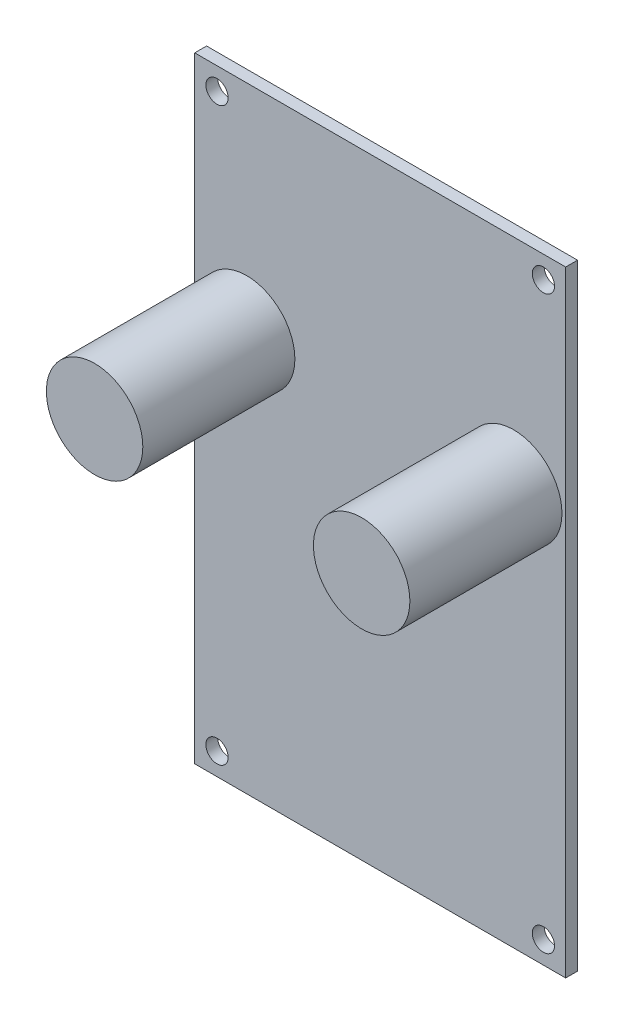
ISO-10303-21;
HEADER;
FILE_DESCRIPTION(('STEP AP214'),'2;1');
FILE_NAME('part.step','',(''),(''),'','','');
FILE_SCHEMA(('AUTOMOTIVE_DESIGN { 1 0 10303 214 1 1 1 1 }'));
ENDSEC;
DATA;
#1=APPLICATION_CONTEXT('core data for automotive mechanical design processes');
#2=APPLICATION_PROTOCOL_DEFINITION('international standard','automotive_design',2000,#1);
#3=PRODUCT_CONTEXT('',#1,'mechanical');
#4=PRODUCT('Part','Part','',(#3));
#5=PRODUCT_RELATED_PRODUCT_CATEGORY('part','',(#4));
#6=PRODUCT_DEFINITION_FORMATION('','',#4);
#7=PRODUCT_DEFINITION_CONTEXT('part definition',#1,'design');
#8=PRODUCT_DEFINITION('design','',#6,#7);
#9=PRODUCT_DEFINITION_SHAPE('','',#8);
#10=(LENGTH_UNIT() NAMED_UNIT(*) SI_UNIT(.MILLI.,.METRE.));
#11=(NAMED_UNIT(*) PLANE_ANGLE_UNIT() SI_UNIT($,.RADIAN.));
#12=(NAMED_UNIT(*) SI_UNIT($,.STERADIAN.) SOLID_ANGLE_UNIT());
#13=UNCERTAINTY_MEASURE_WITH_UNIT(LENGTH_MEASURE(1.E-05),#10,'distance_accuracy_value','');
#14=(GEOMETRIC_REPRESENTATION_CONTEXT(3) GLOBAL_UNCERTAINTY_ASSIGNED_CONTEXT((#13)) GLOBAL_UNIT_ASSIGNED_CONTEXT((#10,
#11,#12)) REPRESENTATION_CONTEXT('',''));
#15=CARTESIAN_POINT('',(0.,0.,0.));
#16=DIRECTION('',(0.,0.,1.));
#17=DIRECTION('',(1.,0.,0.));
#18=AXIS2_PLACEMENT_3D('',#15,#16,#17);
#19=CARTESIAN_POINT('',(0.,0.,1.6));
#20=DIRECTION('',(0.,0.,1.));
#21=DIRECTION('',(1.,0.,0.));
#22=AXIS2_PLACEMENT_3D('',#19,#20,#21);
#23=PLANE('',#22);
#24=CARTESIAN_POINT('',(43.,-29.,1.6));
#25=DIRECTION('',(0.,0.,1.));
#26=DIRECTION('',(1.,0.,0.));
#27=AXIS2_PLACEMENT_3D('',#24,#25,#26);
#28=CIRCLE('',#27,6.5);
#29=CARTESIAN_POINT('',(49.5,-29.,1.6));
#30=VERTEX_POINT('',#29);
#31=EDGE_CURVE('E142',#30,#30,#28,.T.);
#32=ORIENTED_EDGE('',*,*,#31,.F.);
#33=EDGE_LOOP('',(#32));
#34=FACE_BOUND('',#33,.T.);
#35=CARTESIAN_POINT('',(7.,-29.,1.6));
#36=DIRECTION('',(0.,0.,1.));
#37=DIRECTION('',(1.,0.,0.));
#38=AXIS2_PLACEMENT_3D('',#35,#36,#37);
#39=CIRCLE('',#38,6.5);
#40=CARTESIAN_POINT('',(13.5,-29.,1.6));
#41=VERTEX_POINT('',#40);
#42=EDGE_CURVE('E136',#41,#41,#39,.T.);
#43=ORIENTED_EDGE('',*,*,#42,.F.);
#44=EDGE_LOOP('',(#43));
#45=FACE_BOUND('',#44,.T.);
#46=CARTESIAN_POINT('',(47.,-80.,1.6));
#47=DIRECTION('',(0.,0.,1.));
#48=DIRECTION('',(1.,0.,0.));
#49=AXIS2_PLACEMENT_3D('',#46,#47,#48);
#50=CIRCLE('',#49,1.5);
#51=CARTESIAN_POINT('',(48.5,-80.,1.6));
#52=VERTEX_POINT('',#51);
#53=EDGE_CURVE('E121',#52,#52,#50,.T.);
#54=ORIENTED_EDGE('',*,*,#53,.F.);
#55=EDGE_LOOP('',(#54));
#56=FACE_BOUND('',#55,.T.);
#57=CARTESIAN_POINT('',(3.,-3.,1.6));
#58=DIRECTION('',(0.,0.,1.));
#59=DIRECTION('',(1.,0.,0.));
#60=AXIS2_PLACEMENT_3D('',#57,#58,#59);
#61=CIRCLE('',#60,1.5);
#62=CARTESIAN_POINT('',(4.5,-3.,1.6));
#63=VERTEX_POINT('',#62);
#64=EDGE_CURVE('E100',#63,#63,#61,.T.);
#65=ORIENTED_EDGE('',*,*,#64,.F.);
#66=EDGE_LOOP('',(#65));
#67=FACE_BOUND('',#66,.T.);
#68=DIRECTION('',(0.,-1.,0.));
#69=VECTOR('',#68,1.);
#70=CARTESIAN_POINT('',(0.,0.,1.6));
#71=LINE('',#70,#69);
#72=CARTESIAN_POINT('',(0.,0.,1.6));
#73=VERTEX_POINT('',#72);
#74=CARTESIAN_POINT('',(0.,-83.,1.6));
#75=VERTEX_POINT('',#74);
#76=EDGE_CURVE('E85',#73,#75,#71,.T.);
#77=ORIENTED_EDGE('',*,*,#76,.T.);
#78=DIRECTION('',(1.,0.,0.));
#79=VECTOR('',#78,1.);
#80=CARTESIAN_POINT('',(0.,-83.,1.6));
#81=LINE('',#80,#79);
#82=CARTESIAN_POINT('',(50.,-83.,1.6));
#83=VERTEX_POINT('',#82);
#84=EDGE_CURVE('E80',#75,#83,#81,.T.);
#85=ORIENTED_EDGE('',*,*,#84,.T.);
#86=DIRECTION('',(0.,1.,0.));
#87=VECTOR('',#86,1.);
#88=CARTESIAN_POINT('',(50.,0.,1.6));
#89=LINE('',#88,#87);
#90=CARTESIAN_POINT('',(50.,0.,1.6));
#91=VERTEX_POINT('',#90);
#92=EDGE_CURVE('E83',#83,#91,#89,.T.);
#93=ORIENTED_EDGE('',*,*,#92,.T.);
#94=DIRECTION('',(-1.,0.,0.));
#95=VECTOR('',#94,1.);
#96=CARTESIAN_POINT('',(0.,0.,1.6));
#97=LINE('',#96,#95);
#98=EDGE_CURVE('E50',#91,#73,#97,.T.);
#99=ORIENTED_EDGE('',*,*,#98,.T.);
#100=EDGE_LOOP('',(#77,#85,#93,#99));
#101=FACE_BOUND('',#100,.T.);
#102=CARTESIAN_POINT('',(47.,-3.,1.6));
#103=DIRECTION('',(0.,0.,1.));
#104=DIRECTION('',(1.,0.,0.));
#105=AXIS2_PLACEMENT_3D('',#102,#103,#104);
#106=CIRCLE('',#105,1.5);
#107=CARTESIAN_POINT('',(48.5,-3.,1.6));
#108=VERTEX_POINT('',#107);
#109=EDGE_CURVE('E115',#108,#108,#106,.T.);
#110=ORIENTED_EDGE('',*,*,#109,.F.);
#111=EDGE_LOOP('',(#110));
#112=FACE_BOUND('',#111,.T.);
#113=CARTESIAN_POINT('',(3.00000000000001,-80.,1.6));
#114=DIRECTION('',(0.,0.,1.));
#115=DIRECTION('',(1.,0.,0.));
#116=AXIS2_PLACEMENT_3D('',#113,#114,#115);
#117=CIRCLE('',#116,1.5);
#118=CARTESIAN_POINT('',(4.50000000000001,-80.,1.6));
#119=VERTEX_POINT('',#118);
#120=EDGE_CURVE('E127',#119,#119,#117,.T.);
#121=ORIENTED_EDGE('',*,*,#120,.F.);
#122=EDGE_LOOP('',(#121));
#123=FACE_BOUND('',#122,.T.);
#124=ADVANCED_FACE('F33',(#34,#45,#56,#67,#101,#112,#123),#23,.T.);
#125=CARTESIAN_POINT('',(0.,0.,0.));
#126=DIRECTION('',(0.,0.,1.));
#127=DIRECTION('',(1.,0.,0.));
#128=AXIS2_PLACEMENT_3D('',#125,#126,#127);
#129=PLANE('',#128);
#130=DIRECTION('',(0.,-1.,0.));
#131=VECTOR('',#130,1.);
#132=CARTESIAN_POINT('',(0.,0.,0.));
#133=LINE('',#132,#131);
#134=CARTESIAN_POINT('',(0.,0.,0.));
#135=VERTEX_POINT('',#134);
#136=CARTESIAN_POINT('',(0.,-83.,0.));
#137=VERTEX_POINT('',#136);
#138=EDGE_CURVE('E97',#135,#137,#133,.T.);
#139=ORIENTED_EDGE('',*,*,#138,.F.);
#140=DIRECTION('',(-1.,0.,0.));
#141=VECTOR('',#140,1.);
#142=CARTESIAN_POINT('',(0.,0.,0.));
#143=LINE('',#142,#141);
#144=CARTESIAN_POINT('',(50.,0.,0.));
#145=VERTEX_POINT('',#144);
#146=EDGE_CURVE('E73',#145,#135,#143,.T.);
#147=ORIENTED_EDGE('',*,*,#146,.F.);
#148=DIRECTION('',(0.,1.,0.));
#149=VECTOR('',#148,1.);
#150=CARTESIAN_POINT('',(50.,0.,0.));
#151=LINE('',#150,#149);
#152=CARTESIAN_POINT('',(50.,-83.,0.));
#153=VERTEX_POINT('',#152);
#154=EDGE_CURVE('E67',#153,#145,#151,.T.);
#155=ORIENTED_EDGE('',*,*,#154,.F.);
#156=DIRECTION('',(1.,0.,0.));
#157=VECTOR('',#156,1.);
#158=CARTESIAN_POINT('',(0.,-83.,0.));
#159=LINE('',#158,#157);
#160=EDGE_CURVE('E89',#137,#153,#159,.T.);
#161=ORIENTED_EDGE('',*,*,#160,.F.);
#162=EDGE_LOOP('',(#139,#147,#155,#161));
#163=FACE_BOUND('',#162,.T.);
#164=CARTESIAN_POINT('',(3.,-3.,0.));
#165=DIRECTION('',(0.,0.,1.));
#166=DIRECTION('',(1.,0.,0.));
#167=AXIS2_PLACEMENT_3D('',#164,#165,#166);
#168=CIRCLE('',#167,1.5);
#169=CARTESIAN_POINT('',(4.5,-3.,0.));
#170=VERTEX_POINT('',#169);
#171=EDGE_CURVE('E112',#170,#170,#168,.T.);
#172=ORIENTED_EDGE('',*,*,#171,.T.);
#173=EDGE_LOOP('',(#172));
#174=FACE_BOUND('',#173,.T.);
#175=CARTESIAN_POINT('',(47.,-3.,0.));
#176=DIRECTION('',(0.,0.,1.));
#177=DIRECTION('',(1.,0.,0.));
#178=AXIS2_PLACEMENT_3D('',#175,#176,#177);
#179=CIRCLE('',#178,1.5);
#180=CARTESIAN_POINT('',(48.5,-3.,0.));
#181=VERTEX_POINT('',#180);
#182=EDGE_CURVE('E118',#181,#181,#179,.T.);
#183=ORIENTED_EDGE('',*,*,#182,.T.);
#184=EDGE_LOOP('',(#183));
#185=FACE_BOUND('',#184,.T.);
#186=CARTESIAN_POINT('',(47.,-80.,0.));
#187=DIRECTION('',(0.,0.,1.));
#188=DIRECTION('',(1.,0.,0.));
#189=AXIS2_PLACEMENT_3D('',#186,#187,#188);
#190=CIRCLE('',#189,1.5);
#191=CARTESIAN_POINT('',(48.5,-80.,0.));
#192=VERTEX_POINT('',#191);
#193=EDGE_CURVE('E124',#192,#192,#190,.T.);
#194=ORIENTED_EDGE('',*,*,#193,.T.);
#195=EDGE_LOOP('',(#194));
#196=FACE_BOUND('',#195,.T.);
#197=CARTESIAN_POINT('',(3.00000000000001,-80.,0.));
#198=DIRECTION('',(0.,0.,1.));
#199=DIRECTION('',(1.,0.,0.));
#200=AXIS2_PLACEMENT_3D('',#197,#198,#199);
#201=CIRCLE('',#200,1.5);
#202=CARTESIAN_POINT('',(4.50000000000001,-80.,0.));
#203=VERTEX_POINT('',#202);
#204=EDGE_CURVE('E130',#203,#203,#201,.T.);
#205=ORIENTED_EDGE('',*,*,#204,.T.);
#206=EDGE_LOOP('',(#205));
#207=FACE_BOUND('',#206,.T.);
#208=ADVANCED_FACE('F108',(#163,#174,#185,#196,#207),#129,.F.);
#209=CARTESIAN_POINT('',(0.,0.,1.6));
#210=DIRECTION('',(1.,0.,0.));
#211=DIRECTION('',(0.,1.,0.));
#212=AXIS2_PLACEMENT_3D('',#209,#210,#211);
#213=PLANE('',#212);
#214=ORIENTED_EDGE('',*,*,#138,.T.);
#215=DIRECTION('',(0.,0.,-1.));
#216=VECTOR('',#215,1.);
#217=CARTESIAN_POINT('',(0.,-83.,1.6));
#218=LINE('',#217,#216);
#219=EDGE_CURVE('E11',#75,#137,#218,.T.);
#220=ORIENTED_EDGE('',*,*,#219,.F.);
#221=ORIENTED_EDGE('',*,*,#76,.F.);
#222=DIRECTION('',(0.,0.,-1.));
#223=VECTOR('',#222,1.);
#224=CARTESIAN_POINT('',(0.,0.,1.6));
#225=LINE('',#224,#223);
#226=EDGE_CURVE('E93',#73,#135,#225,.T.);
#227=ORIENTED_EDGE('',*,*,#226,.T.);
#228=EDGE_LOOP('',(#214,#220,#221,#227));
#229=FACE_BOUND('',#228,.T.);
#230=ADVANCED_FACE('F35',(#229),#213,.F.);
#231=CARTESIAN_POINT('',(0.,-83.,1.6));
#232=DIRECTION('',(0.,1.,0.));
#233=DIRECTION('',(0.,0.,1.));
#234=AXIS2_PLACEMENT_3D('',#231,#232,#233);
#235=PLANE('',#234);
#236=ORIENTED_EDGE('',*,*,#160,.T.);
#237=DIRECTION('',(0.,0.,-1.));
#238=VECTOR('',#237,1.);
#239=CARTESIAN_POINT('',(50.,-83.,1.6));
#240=LINE('',#239,#238);
#241=EDGE_CURVE('E42',#83,#153,#240,.T.);
#242=ORIENTED_EDGE('',*,*,#241,.F.);
#243=ORIENTED_EDGE('',*,*,#84,.F.);
#244=ORIENTED_EDGE('',*,*,#219,.T.);
#245=EDGE_LOOP('',(#236,#242,#243,#244));
#246=FACE_BOUND('',#245,.T.);
#247=ADVANCED_FACE('F88',(#246),#235,.F.);
#248=CARTESIAN_POINT('',(50.,0.,1.6));
#249=DIRECTION('',(-1.,0.,0.));
#250=DIRECTION('',(0.,-1.,0.));
#251=AXIS2_PLACEMENT_3D('',#248,#249,#250);
#252=PLANE('',#251);
#253=ORIENTED_EDGE('',*,*,#154,.T.);
#254=DIRECTION('',(0.,0.,-1.));
#255=VECTOR('',#254,1.);
#256=CARTESIAN_POINT('',(50.,0.,1.6));
#257=LINE('',#256,#255);
#258=EDGE_CURVE('E90',#91,#145,#257,.T.);
#259=ORIENTED_EDGE('',*,*,#258,.F.);
#260=ORIENTED_EDGE('',*,*,#92,.F.);
#261=ORIENTED_EDGE('',*,*,#241,.T.);
#262=EDGE_LOOP('',(#253,#259,#260,#261));
#263=FACE_BOUND('',#262,.T.);
#264=ADVANCED_FACE('F91',(#263),#252,.F.);
#265=CARTESIAN_POINT('',(0.,0.,1.6));
#266=DIRECTION('',(0.,-1.,0.));
#267=DIRECTION('',(0.,0.,-1.));
#268=AXIS2_PLACEMENT_3D('',#265,#266,#267);
#269=PLANE('',#268);
#270=ORIENTED_EDGE('',*,*,#146,.T.);
#271=ORIENTED_EDGE('',*,*,#226,.F.);
#272=ORIENTED_EDGE('',*,*,#98,.F.);
#273=ORIENTED_EDGE('',*,*,#258,.T.);
#274=EDGE_LOOP('',(#270,#271,#272,#273));
#275=FACE_BOUND('',#274,.T.);
#276=ADVANCED_FACE('F105',(#275),#269,.F.);
#277=CARTESIAN_POINT('',(3.,-3.,1.6));
#278=DIRECTION('',(0.,0.,-1.));
#279=DIRECTION('',(-1.,0.,0.));
#280=AXIS2_PLACEMENT_3D('',#277,#278,#279);
#281=CYLINDRICAL_SURFACE('',#280,1.5);
#282=ORIENTED_EDGE('',*,*,#64,.T.);
#283=EDGE_LOOP('',(#282));
#284=FACE_BOUND('',#283,.T.);
#285=ORIENTED_EDGE('',*,*,#171,.F.);
#286=EDGE_LOOP('',(#285));
#287=FACE_BOUND('',#286,.T.);
#288=ADVANCED_FACE('F166',(#284,#287),#281,.F.);
#289=CARTESIAN_POINT('',(47.,-3.,1.6));
#290=DIRECTION('',(0.,0.,-1.));
#291=DIRECTION('',(-1.,0.,0.));
#292=AXIS2_PLACEMENT_3D('',#289,#290,#291);
#293=CYLINDRICAL_SURFACE('',#292,1.5);
#294=ORIENTED_EDGE('',*,*,#109,.T.);
#295=EDGE_LOOP('',(#294));
#296=FACE_BOUND('',#295,.T.);
#297=ORIENTED_EDGE('',*,*,#182,.F.);
#298=EDGE_LOOP('',(#297));
#299=FACE_BOUND('',#298,.T.);
#300=ADVANCED_FACE('F169',(#296,#299),#293,.F.);
#301=CARTESIAN_POINT('',(47.,-80.,1.6));
#302=DIRECTION('',(0.,0.,-1.));
#303=DIRECTION('',(-1.,0.,0.));
#304=AXIS2_PLACEMENT_3D('',#301,#302,#303);
#305=CYLINDRICAL_SURFACE('',#304,1.5);
#306=ORIENTED_EDGE('',*,*,#53,.T.);
#307=EDGE_LOOP('',(#306));
#308=FACE_BOUND('',#307,.T.);
#309=ORIENTED_EDGE('',*,*,#193,.F.);
#310=EDGE_LOOP('',(#309));
#311=FACE_BOUND('',#310,.T.);
#312=ADVANCED_FACE('F184',(#308,#311),#305,.F.);
#313=CARTESIAN_POINT('',(3.00000000000001,-80.,1.6));
#314=DIRECTION('',(0.,0.,-1.));
#315=DIRECTION('',(-1.,0.,0.));
#316=AXIS2_PLACEMENT_3D('',#313,#314,#315);
#317=CYLINDRICAL_SURFACE('',#316,1.5);
#318=ORIENTED_EDGE('',*,*,#120,.T.);
#319=EDGE_LOOP('',(#318));
#320=FACE_BOUND('',#319,.T.);
#321=ORIENTED_EDGE('',*,*,#204,.F.);
#322=EDGE_LOOP('',(#321));
#323=FACE_BOUND('',#322,.T.);
#324=ADVANCED_FACE('F181',(#320,#323),#317,.F.);
#325=CARTESIAN_POINT('',(7.,-29.,22.1));
#326=DIRECTION('',(0.,0.,-1.));
#327=DIRECTION('',(-1.,0.,0.));
#328=AXIS2_PLACEMENT_3D('',#325,#326,#327);
#329=CYLINDRICAL_SURFACE('',#328,6.5);
#330=CARTESIAN_POINT('',(7.,-29.,22.1));
#331=DIRECTION('',(0.,0.,1.));
#332=DIRECTION('',(1.,0.,0.));
#333=AXIS2_PLACEMENT_3D('',#330,#331,#332);
#334=CIRCLE('',#333,6.5);
#335=CARTESIAN_POINT('',(13.5,-29.,22.1));
#336=VERTEX_POINT('',#335);
#337=EDGE_CURVE('E133',#336,#336,#334,.T.);
#338=ORIENTED_EDGE('',*,*,#337,.F.);
#339=EDGE_LOOP('',(#338));
#340=FACE_BOUND('',#339,.T.);
#341=ORIENTED_EDGE('',*,*,#42,.T.);
#342=EDGE_LOOP('',(#341));
#343=FACE_BOUND('',#342,.T.);
#344=ADVANCED_FACE('F183',(#340,#343),#329,.T.);
#345=CARTESIAN_POINT('',(7.,-29.,22.1));
#346=DIRECTION('',(0.,0.,1.));
#347=DIRECTION('',(1.,0.,0.));
#348=AXIS2_PLACEMENT_3D('',#345,#346,#347);
#349=PLANE('',#348);
#350=ORIENTED_EDGE('',*,*,#337,.T.);
#351=EDGE_LOOP('',(#350));
#352=FACE_BOUND('',#351,.T.);
#353=ADVANCED_FACE('F153',(#352),#349,.T.);
#354=CARTESIAN_POINT('',(43.,-29.,22.1));
#355=DIRECTION('',(0.,0.,-1.));
#356=DIRECTION('',(-1.,0.,0.));
#357=AXIS2_PLACEMENT_3D('',#354,#355,#356);
#358=CYLINDRICAL_SURFACE('',#357,6.5);
#359=CARTESIAN_POINT('',(43.,-29.,22.1));
#360=DIRECTION('',(0.,0.,1.));
#361=DIRECTION('',(1.,0.,0.));
#362=AXIS2_PLACEMENT_3D('',#359,#360,#361);
#363=CIRCLE('',#362,6.5);
#364=CARTESIAN_POINT('',(49.5,-29.,22.1));
#365=VERTEX_POINT('',#364);
#366=EDGE_CURVE('E139',#365,#365,#363,.T.);
#367=ORIENTED_EDGE('',*,*,#366,.F.);
#368=EDGE_LOOP('',(#367));
#369=FACE_BOUND('',#368,.T.);
#370=ORIENTED_EDGE('',*,*,#31,.T.);
#371=EDGE_LOOP('',(#370));
#372=FACE_BOUND('',#371,.T.);
#373=ADVANCED_FACE('F150',(#369,#372),#358,.T.);
#374=CARTESIAN_POINT('',(43.,-29.,22.1));
#375=DIRECTION('',(0.,0.,1.));
#376=DIRECTION('',(1.,0.,0.));
#377=AXIS2_PLACEMENT_3D('',#374,#375,#376);
#378=PLANE('',#377);
#379=ORIENTED_EDGE('',*,*,#366,.T.);
#380=EDGE_LOOP('',(#379));
#381=FACE_BOUND('',#380,.T.);
#382=ADVANCED_FACE('F148',(#381),#378,.T.);
#383=CLOSED_SHELL('',(#124,#208,#230,#247,#264,#276,#288,#300,#312,#324,#344,#353,#373,#382));
#384=MANIFOLD_SOLID_BREP('B2',#383);
#385=ADVANCED_BREP_SHAPE_REPRESENTATION('',(#18,#384),#14);
#386=SHAPE_DEFINITION_REPRESENTATION(#9,#385);
ENDSEC;
END-ISO-10303-21;
